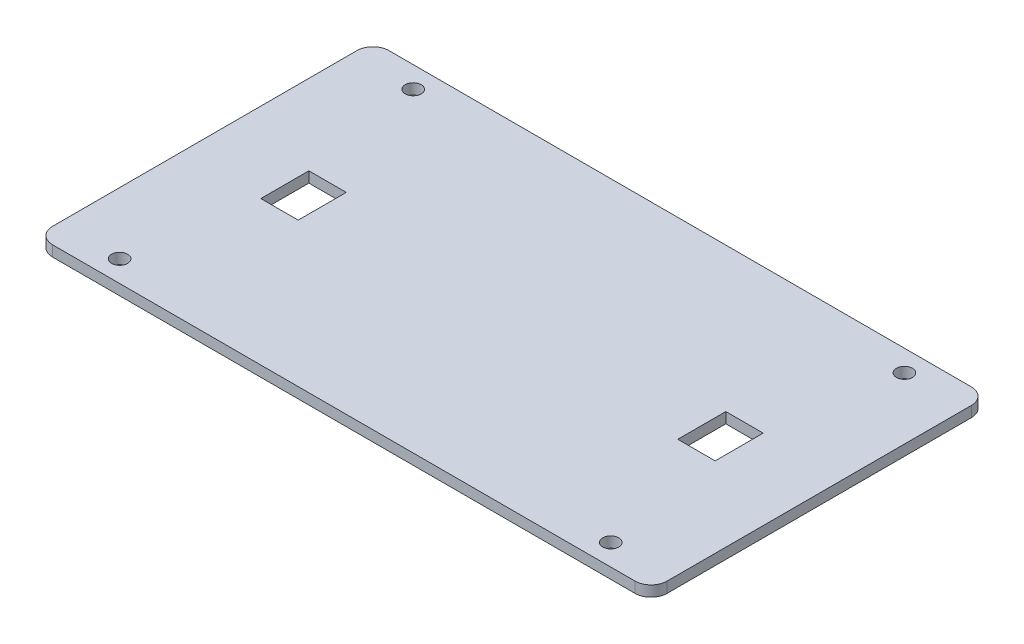
ISO-10303-21;
HEADER;
FILE_DESCRIPTION(('STEP AP214'),'2;1');
FILE_NAME('part.step','',(''),(''),'','','');
FILE_SCHEMA(('AUTOMOTIVE_DESIGN { 1 0 10303 214 1 1 1 1 }'));
ENDSEC;
DATA;
#1=APPLICATION_CONTEXT('core data for automotive mechanical design processes');
#2=APPLICATION_PROTOCOL_DEFINITION('international standard','automotive_design',2000,#1);
#3=PRODUCT_CONTEXT('',#1,'mechanical');
#4=PRODUCT('Part','Part','',(#3));
#5=PRODUCT_RELATED_PRODUCT_CATEGORY('part','',(#4));
#6=PRODUCT_DEFINITION_FORMATION('','',#4);
#7=PRODUCT_DEFINITION_CONTEXT('part definition',#1,'design');
#8=PRODUCT_DEFINITION('design','',#6,#7);
#9=PRODUCT_DEFINITION_SHAPE('','',#8);
#10=(LENGTH_UNIT() NAMED_UNIT(*) SI_UNIT(.MILLI.,.METRE.));
#11=(NAMED_UNIT(*) PLANE_ANGLE_UNIT() SI_UNIT($,.RADIAN.));
#12=(NAMED_UNIT(*) SI_UNIT($,.STERADIAN.) SOLID_ANGLE_UNIT());
#13=UNCERTAINTY_MEASURE_WITH_UNIT(LENGTH_MEASURE(1.E-05),#10,'distance_accuracy_value','');
#14=(GEOMETRIC_REPRESENTATION_CONTEXT(3) GLOBAL_UNCERTAINTY_ASSIGNED_CONTEXT((#13)) GLOBAL_UNIT_ASSIGNED_CONTEXT((#10,
#11,#12)) REPRESENTATION_CONTEXT('',''));
#15=CARTESIAN_POINT('',(0.,0.,0.));
#16=DIRECTION('',(0.,0.,1.));
#17=DIRECTION('',(1.,0.,0.));
#18=AXIS2_PLACEMENT_3D('',#15,#16,#17);
#19=CARTESIAN_POINT('',(-57.5483884452991,2.,31.5));
#20=DIRECTION('',(1.,0.,0.));
#21=DIRECTION('',(0.,0.,-1.));
#22=AXIS2_PLACEMENT_3D('',#19,#20,#21);
#23=PLANE('',#22);
#24=DIRECTION('',(0.,0.,1.));
#25=VECTOR('',#24,1.);
#26=CARTESIAN_POINT('',(-57.5483884452991,0.,31.5));
#27=LINE('',#26,#25);
#28=CARTESIAN_POINT('',(-57.5483884452991,0.,-28.5));
#29=VERTEX_POINT('',#28);
#30=CARTESIAN_POINT('',(-57.5483884452991,0.,28.5));
#31=VERTEX_POINT('',#30);
#32=EDGE_CURVE('E255',#29,#31,#27,.T.);
#33=ORIENTED_EDGE('',*,*,#32,.T.);
#34=DIRECTION('',(0.,-1.,0.));
#35=VECTOR('',#34,1.);
#36=CARTESIAN_POINT('',(-57.5483884452991,2.,28.5));
#37=LINE('',#36,#35);
#38=CARTESIAN_POINT('',(-57.5483884452991,2.,28.5));
#39=VERTEX_POINT('',#38);
#40=EDGE_CURVE('E11',#31,#39,#37,.F.);
#41=ORIENTED_EDGE('',*,*,#40,.T.);
#42=DIRECTION('',(0.,0.,1.));
#43=VECTOR('',#42,1.);
#44=CARTESIAN_POINT('',(-57.5483884452991,2.,31.5));
#45=LINE('',#44,#43);
#46=CARTESIAN_POINT('',(-57.5483884452991,2.,-28.5));
#47=VERTEX_POINT('',#46);
#48=EDGE_CURVE('E256',#47,#39,#45,.T.);
#49=ORIENTED_EDGE('',*,*,#48,.F.);
#50=DIRECTION('',(0.,-1.,0.));
#51=VECTOR('',#50,1.);
#52=CARTESIAN_POINT('',(-57.5483884452991,2.,-28.5));
#53=LINE('',#52,#51);
#54=EDGE_CURVE('E48',#47,#29,#53,.T.);
#55=ORIENTED_EDGE('',*,*,#54,.T.);
#56=EDGE_LOOP('',(#33,#41,#49,#55));
#57=FACE_BOUND('',#56,.T.);
#58=ADVANCED_FACE('F39',(#57),#23,.F.);
#59=CARTESIAN_POINT('',(57.548388445299,2.,31.5));
#60=DIRECTION('',(0.,0.,-1.));
#61=DIRECTION('',(-1.,0.,0.));
#62=AXIS2_PLACEMENT_3D('',#59,#60,#61);
#63=PLANE('',#62);
#64=DIRECTION('',(1.,0.,0.));
#65=VECTOR('',#64,1.);
#66=CARTESIAN_POINT('',(57.548388445299,0.,31.5));
#67=LINE('',#66,#65);
#68=CARTESIAN_POINT('',(-54.5483884452991,0.,31.5));
#69=VERTEX_POINT('',#68);
#70=CARTESIAN_POINT('',(54.548388445299,0.,31.5));
#71=VERTEX_POINT('',#70);
#72=EDGE_CURVE('E277',#69,#71,#67,.T.);
#73=ORIENTED_EDGE('',*,*,#72,.T.);
#74=DIRECTION('',(0.,-1.,0.));
#75=VECTOR('',#74,1.);
#76=CARTESIAN_POINT('',(54.548388445299,2.,31.5));
#77=LINE('',#76,#75);
#78=CARTESIAN_POINT('',(54.548388445299,2.,31.5));
#79=VERTEX_POINT('',#78);
#80=EDGE_CURVE('E329',#71,#79,#77,.F.);
#81=ORIENTED_EDGE('',*,*,#80,.T.);
#82=DIRECTION('',(1.,0.,0.));
#83=VECTOR('',#82,1.);
#84=CARTESIAN_POINT('',(57.548388445299,2.,31.5));
#85=LINE('',#84,#83);
#86=CARTESIAN_POINT('',(-54.5483884452991,2.,31.5));
#87=VERTEX_POINT('',#86);
#88=EDGE_CURVE('E260',#87,#79,#85,.T.);
#89=ORIENTED_EDGE('',*,*,#88,.F.);
#90=DIRECTION('',(0.,-1.,0.));
#91=VECTOR('',#90,1.);
#92=CARTESIAN_POINT('',(-54.5483884452991,2.,31.5));
#93=LINE('',#92,#91);
#94=EDGE_CURVE('E325',#87,#69,#93,.T.);
#95=ORIENTED_EDGE('',*,*,#94,.T.);
#96=EDGE_LOOP('',(#73,#81,#89,#95));
#97=FACE_BOUND('',#96,.T.);
#98=ADVANCED_FACE('F349',(#97),#63,.F.);
#99=CARTESIAN_POINT('',(57.548388445299,2.,-31.5));
#100=DIRECTION('',(-1.,0.,0.));
#101=DIRECTION('',(0.,0.,1.));
#102=AXIS2_PLACEMENT_3D('',#99,#100,#101);
#103=PLANE('',#102);
#104=DIRECTION('',(0.,0.,-1.));
#105=VECTOR('',#104,1.);
#106=CARTESIAN_POINT('',(57.548388445299,0.,-31.5));
#107=LINE('',#106,#105);
#108=CARTESIAN_POINT('',(57.548388445299,0.,28.5));
#109=VERTEX_POINT('',#108);
#110=CARTESIAN_POINT('',(57.548388445299,0.,-28.5));
#111=VERTEX_POINT('',#110);
#112=EDGE_CURVE('E281',#109,#111,#107,.T.);
#113=ORIENTED_EDGE('',*,*,#112,.T.);
#114=DIRECTION('',(0.,-1.,0.));
#115=VECTOR('',#114,1.);
#116=CARTESIAN_POINT('',(57.548388445299,2.,-28.5));
#117=LINE('',#116,#115);
#118=CARTESIAN_POINT('',(57.548388445299,2.,-28.5));
#119=VERTEX_POINT('',#118);
#120=EDGE_CURVE('E310',#111,#119,#117,.F.);
#121=ORIENTED_EDGE('',*,*,#120,.T.);
#122=DIRECTION('',(0.,0.,-1.));
#123=VECTOR('',#122,1.);
#124=CARTESIAN_POINT('',(57.548388445299,2.,-31.5));
#125=LINE('',#124,#123);
#126=CARTESIAN_POINT('',(57.548388445299,2.,28.5));
#127=VERTEX_POINT('',#126);
#128=EDGE_CURVE('E265',#127,#119,#125,.T.);
#129=ORIENTED_EDGE('',*,*,#128,.F.);
#130=DIRECTION('',(0.,-1.,0.));
#131=VECTOR('',#130,1.);
#132=CARTESIAN_POINT('',(57.548388445299,2.,28.5));
#133=LINE('',#132,#131);
#134=EDGE_CURVE('E306',#127,#109,#133,.T.);
#135=ORIENTED_EDGE('',*,*,#134,.T.);
#136=EDGE_LOOP('',(#113,#121,#129,#135));
#137=FACE_BOUND('',#136,.T.);
#138=ADVANCED_FACE('F360',(#137),#103,.F.);
#139=CARTESIAN_POINT('',(-57.5483884452991,2.,-31.5));
#140=DIRECTION('',(0.,0.,1.));
#141=DIRECTION('',(1.,0.,0.));
#142=AXIS2_PLACEMENT_3D('',#139,#140,#141);
#143=PLANE('',#142);
#144=DIRECTION('',(-1.,0.,0.));
#145=VECTOR('',#144,1.);
#146=CARTESIAN_POINT('',(-57.5483884452991,2.,-31.5));
#147=LINE('',#146,#145);
#148=CARTESIAN_POINT('',(54.548388445299,2.,-31.5));
#149=VERTEX_POINT('',#148);
#150=CARTESIAN_POINT('',(-54.5483884452991,2.,-31.5));
#151=VERTEX_POINT('',#150);
#152=EDGE_CURVE('E269',#149,#151,#147,.T.);
#153=ORIENTED_EDGE('',*,*,#152,.F.);
#154=DIRECTION('',(0.,-1.,0.));
#155=VECTOR('',#154,1.);
#156=CARTESIAN_POINT('',(54.548388445299,2.,-31.5));
#157=LINE('',#156,#155);
#158=CARTESIAN_POINT('',(54.548388445299,0.,-31.5));
#159=VERTEX_POINT('',#158);
#160=EDGE_CURVE('E290',#149,#159,#157,.T.);
#161=ORIENTED_EDGE('',*,*,#160,.T.);
#162=DIRECTION('',(-1.,0.,0.));
#163=VECTOR('',#162,1.);
#164=CARTESIAN_POINT('',(-57.5483884452991,0.,-31.5));
#165=LINE('',#164,#163);
#166=CARTESIAN_POINT('',(-54.5483884452991,0.,-31.5));
#167=VERTEX_POINT('',#166);
#168=EDGE_CURVE('E261',#159,#167,#165,.T.);
#169=ORIENTED_EDGE('',*,*,#168,.T.);
#170=DIRECTION('',(0.,-1.,0.));
#171=VECTOR('',#170,1.);
#172=CARTESIAN_POINT('',(-54.5483884452991,2.,-31.5));
#173=LINE('',#172,#171);
#174=EDGE_CURVE('E273',#167,#151,#173,.F.);
#175=ORIENTED_EDGE('',*,*,#174,.T.);
#176=EDGE_LOOP('',(#153,#161,#169,#175));
#177=FACE_BOUND('',#176,.T.);
#178=ADVANCED_FACE('F368',(#177),#143,.F.);
#179=CARTESIAN_POINT('',(0.,2.,0.));
#180=DIRECTION('',(0.,-1.,0.));
#181=DIRECTION('',(0.,0.,-1.));
#182=AXIS2_PLACEMENT_3D('',#179,#180,#181);
#183=PLANE('',#182);
#184=CARTESIAN_POINT('',(-45.998388445299,2.,27.5));
#185=DIRECTION('',(0.,1.,0.));
#186=DIRECTION('',(0.,0.,-1.));
#187=AXIS2_PLACEMENT_3D('',#184,#185,#186);
#188=CIRCLE('',#187,1.5);
#189=CARTESIAN_POINT('',(-45.998388445299,2.,26.));
#190=VERTEX_POINT('',#189);
#191=EDGE_CURVE('E571',#190,#190,#188,.T.);
#192=ORIENTED_EDGE('',*,*,#191,.F.);
#193=EDGE_LOOP('',(#192));
#194=FACE_BOUND('',#193,.T.);
#195=CARTESIAN_POINT('',(45.998388445299,2.,27.5));
#196=DIRECTION('',(0.,1.,0.));
#197=DIRECTION('',(0.,0.,1.));
#198=AXIS2_PLACEMENT_3D('',#195,#196,#197);
#199=CIRCLE('',#198,1.5);
#200=CARTESIAN_POINT('',(45.998388445299,2.,29.));
#201=VERTEX_POINT('',#200);
#202=EDGE_CURVE('E575',#201,#201,#199,.T.);
#203=ORIENTED_EDGE('',*,*,#202,.F.);
#204=EDGE_LOOP('',(#203));
#205=FACE_BOUND('',#204,.T.);
#206=CARTESIAN_POINT('',(45.998388445299,2.,-27.5));
#207=DIRECTION('',(0.,1.,0.));
#208=DIRECTION('',(0.,0.,-1.));
#209=AXIS2_PLACEMENT_3D('',#206,#207,#208);
#210=CIRCLE('',#209,1.5);
#211=CARTESIAN_POINT('',(45.998388445299,2.,-29.));
#212=VERTEX_POINT('',#211);
#213=EDGE_CURVE('E589',#212,#212,#210,.T.);
#214=ORIENTED_EDGE('',*,*,#213,.F.);
#215=EDGE_LOOP('',(#214));
#216=FACE_BOUND('',#215,.T.);
#217=CARTESIAN_POINT('',(-45.9983884452991,2.,-27.5));
#218=DIRECTION('',(0.,1.,0.));
#219=DIRECTION('',(0.,0.,1.));
#220=AXIS2_PLACEMENT_3D('',#217,#218,#219);
#221=CIRCLE('',#220,1.5);
#222=CARTESIAN_POINT('',(-45.9983884452991,2.,-26.));
#223=VERTEX_POINT('',#222);
#224=EDGE_CURVE('E184',#223,#223,#221,.T.);
#225=ORIENTED_EDGE('',*,*,#224,.F.);
#226=EDGE_LOOP('',(#225));
#227=FACE_BOUND('',#226,.T.);
#228=DIRECTION('',(0.,0.,-1.));
#229=VECTOR('',#228,1.);
#230=CARTESIAN_POINT('',(-42.5483884452991,2.,0.));
#231=LINE('',#230,#229);
#232=CARTESIAN_POINT('',(-42.5483884452991,2.,4.5));
#233=VERTEX_POINT('',#232);
#234=CARTESIAN_POINT('',(-42.5483884452991,2.,-4.5));
#235=VERTEX_POINT('',#234);
#236=EDGE_CURVE('E242',#233,#235,#231,.T.);
#237=ORIENTED_EDGE('',*,*,#236,.T.);
#238=DIRECTION('',(1.,0.,0.));
#239=VECTOR('',#238,1.);
#240=CARTESIAN_POINT('',(0.,2.,-4.5));
#241=LINE('',#240,#239);
#242=CARTESIAN_POINT('',(-35.5483884452991,2.,-4.5));
#243=VERTEX_POINT('',#242);
#244=EDGE_CURVE('E157',#235,#243,#241,.T.);
#245=ORIENTED_EDGE('',*,*,#244,.T.);
#246=DIRECTION('',(0.,0.,1.));
#247=VECTOR('',#246,1.);
#248=CARTESIAN_POINT('',(-35.5483884452991,2.,0.));
#249=LINE('',#248,#247);
#250=CARTESIAN_POINT('',(-35.5483884452991,2.,4.5));
#251=VERTEX_POINT('',#250);
#252=EDGE_CURVE('E249',#243,#251,#249,.T.);
#253=ORIENTED_EDGE('',*,*,#252,.T.);
#254=DIRECTION('',(-1.,0.,0.));
#255=VECTOR('',#254,1.);
#256=CARTESIAN_POINT('',(0.,2.,4.5));
#257=LINE('',#256,#255);
#258=EDGE_CURVE('E245',#251,#233,#257,.T.);
#259=ORIENTED_EDGE('',*,*,#258,.T.);
#260=EDGE_LOOP('',(#237,#245,#253,#259));
#261=FACE_BOUND('',#260,.T.);
#262=DIRECTION('',(-1.,0.,0.));
#263=VECTOR('',#262,1.);
#264=CARTESIAN_POINT('',(0.,2.,4.5));
#265=LINE('',#264,#263);
#266=CARTESIAN_POINT('',(42.5483884452991,2.,4.5));
#267=VERTEX_POINT('',#266);
#268=CARTESIAN_POINT('',(35.5483884452991,2.,4.5));
#269=VERTEX_POINT('',#268);
#270=EDGE_CURVE('E194',#267,#269,#265,.T.);
#271=ORIENTED_EDGE('',*,*,#270,.T.);
#272=DIRECTION('',(0.,0.,-1.));
#273=VECTOR('',#272,1.);
#274=CARTESIAN_POINT('',(35.5483884452991,2.,0.));
#275=LINE('',#274,#273);
#276=CARTESIAN_POINT('',(35.5483884452991,2.,-4.5));
#277=VERTEX_POINT('',#276);
#278=EDGE_CURVE('E238',#269,#277,#275,.T.);
#279=ORIENTED_EDGE('',*,*,#278,.T.);
#280=DIRECTION('',(1.,0.,0.));
#281=VECTOR('',#280,1.);
#282=CARTESIAN_POINT('',(0.,2.,-4.5));
#283=LINE('',#282,#281);
#284=CARTESIAN_POINT('',(42.5483884452991,2.,-4.5));
#285=VERTEX_POINT('',#284);
#286=EDGE_CURVE('E234',#277,#285,#283,.T.);
#287=ORIENTED_EDGE('',*,*,#286,.T.);
#288=DIRECTION('',(0.,0.,1.));
#289=VECTOR('',#288,1.);
#290=CARTESIAN_POINT('',(42.5483884452991,2.,0.));
#291=LINE('',#290,#289);
#292=EDGE_CURVE('E230',#285,#267,#291,.T.);
#293=ORIENTED_EDGE('',*,*,#292,.T.);
#294=EDGE_LOOP('',(#271,#279,#287,#293));
#295=FACE_BOUND('',#294,.T.);
#296=ORIENTED_EDGE('',*,*,#128,.T.);
#297=CARTESIAN_POINT('',(54.548388445299,2.,-28.5));
#298=DIRECTION('',(0.,-1.,0.));
#299=DIRECTION('',(0.,0.,-1.));
#300=AXIS2_PLACEMENT_3D('',#297,#298,#299);
#301=CIRCLE('',#300,3.);
#302=EDGE_CURVE('E322',#119,#149,#301,.F.);
#303=ORIENTED_EDGE('',*,*,#302,.T.);
#304=ORIENTED_EDGE('',*,*,#152,.T.);
#305=CARTESIAN_POINT('',(-54.5483884452991,2.,-28.5));
#306=DIRECTION('',(0.,-1.,0.));
#307=DIRECTION('',(0.,0.,-1.));
#308=AXIS2_PLACEMENT_3D('',#305,#306,#307);
#309=CIRCLE('',#308,3.);
#310=EDGE_CURVE('E313',#151,#47,#309,.F.);
#311=ORIENTED_EDGE('',*,*,#310,.T.);
#312=ORIENTED_EDGE('',*,*,#48,.T.);
#313=CARTESIAN_POINT('',(-54.5483884452991,2.,28.5));
#314=DIRECTION('',(0.,-1.,0.));
#315=DIRECTION('',(0.,0.,-1.));
#316=AXIS2_PLACEMENT_3D('',#313,#314,#315);
#317=CIRCLE('',#316,3.);
#318=EDGE_CURVE('E316',#39,#87,#317,.F.);
#319=ORIENTED_EDGE('',*,*,#318,.T.);
#320=ORIENTED_EDGE('',*,*,#88,.T.);
#321=CARTESIAN_POINT('',(54.548388445299,2.,28.5));
#322=DIRECTION('',(0.,-1.,0.));
#323=DIRECTION('',(0.,0.,-1.));
#324=AXIS2_PLACEMENT_3D('',#321,#322,#323);
#325=CIRCLE('',#324,3.);
#326=EDGE_CURVE('E319',#79,#127,#325,.F.);
#327=ORIENTED_EDGE('',*,*,#326,.T.);
#328=EDGE_LOOP('',(#296,#303,#304,#311,#312,#319,#320,#327));
#329=FACE_BOUND('',#328,.T.);
#330=ADVANCED_FACE('F353',(#194,#205,#216,#227,#261,#295,#329),#183,.F.);
#331=CARTESIAN_POINT('',(0.,0.,0.));
#332=DIRECTION('',(0.,-1.,0.));
#333=DIRECTION('',(0.,0.,-1.));
#334=AXIS2_PLACEMENT_3D('',#331,#332,#333);
#335=PLANE('',#334);
#336=CARTESIAN_POINT('',(-45.998388445299,0.,27.5));
#337=DIRECTION('',(0.,1.,0.));
#338=DIRECTION('',(0.,0.,-1.));
#339=AXIS2_PLACEMENT_3D('',#336,#337,#338);
#340=CIRCLE('',#339,1.5);
#341=CARTESIAN_POINT('',(-45.998388445299,0.,26.));
#342=VERTEX_POINT('',#341);
#343=EDGE_CURVE('E568',#342,#342,#340,.T.);
#344=ORIENTED_EDGE('',*,*,#343,.T.);
#345=EDGE_LOOP('',(#344));
#346=FACE_BOUND('',#345,.T.);
#347=CARTESIAN_POINT('',(45.998388445299,0.,27.5));
#348=DIRECTION('',(0.,1.,0.));
#349=DIRECTION('',(0.,0.,1.));
#350=AXIS2_PLACEMENT_3D('',#347,#348,#349);
#351=CIRCLE('',#350,1.5);
#352=CARTESIAN_POINT('',(45.998388445299,0.,29.));
#353=VERTEX_POINT('',#352);
#354=EDGE_CURVE('E595',#353,#353,#351,.T.);
#355=ORIENTED_EDGE('',*,*,#354,.T.);
#356=EDGE_LOOP('',(#355));
#357=FACE_BOUND('',#356,.T.);
#358=CARTESIAN_POINT('',(45.998388445299,0.,-27.5));
#359=DIRECTION('',(0.,1.,0.));
#360=DIRECTION('',(0.,0.,-1.));
#361=AXIS2_PLACEMENT_3D('',#358,#359,#360);
#362=CIRCLE('',#361,1.5);
#363=CARTESIAN_POINT('',(45.998388445299,0.,-29.));
#364=VERTEX_POINT('',#363);
#365=EDGE_CURVE('E584',#364,#364,#362,.T.);
#366=ORIENTED_EDGE('',*,*,#365,.T.);
#367=EDGE_LOOP('',(#366));
#368=FACE_BOUND('',#367,.T.);
#369=CARTESIAN_POINT('',(-45.9983884452991,0.,-27.5));
#370=DIRECTION('',(0.,1.,0.));
#371=DIRECTION('',(0.,0.,1.));
#372=AXIS2_PLACEMENT_3D('',#369,#370,#371);
#373=CIRCLE('',#372,1.5);
#374=CARTESIAN_POINT('',(-45.9983884452991,0.,-26.));
#375=VERTEX_POINT('',#374);
#376=EDGE_CURVE('E206',#375,#375,#373,.T.);
#377=ORIENTED_EDGE('',*,*,#376,.T.);
#378=EDGE_LOOP('',(#377));
#379=FACE_BOUND('',#378,.T.);
#380=DIRECTION('',(-1.,0.,0.));
#381=VECTOR('',#380,1.);
#382=CARTESIAN_POINT('',(-42.5483884452991,0.,-4.5));
#383=LINE('',#382,#381);
#384=CARTESIAN_POINT('',(-35.5483884452991,0.,-4.5));
#385=VERTEX_POINT('',#384);
#386=CARTESIAN_POINT('',(-42.5483884452991,0.,-4.5));
#387=VERTEX_POINT('',#386);
#388=EDGE_CURVE('E154',#385,#387,#383,.T.);
#389=ORIENTED_EDGE('',*,*,#388,.T.);
#390=DIRECTION('',(0.,0.,1.));
#391=VECTOR('',#390,1.);
#392=CARTESIAN_POINT('',(-42.5483884452991,0.,4.5));
#393=LINE('',#392,#391);
#394=CARTESIAN_POINT('',(-42.5483884452991,0.,4.5));
#395=VERTEX_POINT('',#394);
#396=EDGE_CURVE('E165',#387,#395,#393,.T.);
#397=ORIENTED_EDGE('',*,*,#396,.T.);
#398=DIRECTION('',(1.,0.,0.));
#399=VECTOR('',#398,1.);
#400=CARTESIAN_POINT('',(-35.5483884452991,0.,4.5));
#401=LINE('',#400,#399);
#402=CARTESIAN_POINT('',(-35.5483884452991,0.,4.5));
#403=VERTEX_POINT('',#402);
#404=EDGE_CURVE('E171',#395,#403,#401,.T.);
#405=ORIENTED_EDGE('',*,*,#404,.T.);
#406=DIRECTION('',(0.,0.,-1.));
#407=VECTOR('',#406,1.);
#408=CARTESIAN_POINT('',(-35.5483884452991,0.,-4.5));
#409=LINE('',#408,#407);
#410=EDGE_CURVE('E161',#403,#385,#409,.T.);
#411=ORIENTED_EDGE('',*,*,#410,.T.);
#412=EDGE_LOOP('',(#389,#397,#405,#411));
#413=FACE_BOUND('',#412,.T.);
#414=DIRECTION('',(0.,0.,1.));
#415=VECTOR('',#414,1.);
#416=CARTESIAN_POINT('',(35.5483884452991,0.,-4.5));
#417=LINE('',#416,#415);
#418=CARTESIAN_POINT('',(35.5483884452991,0.,-4.5));
#419=VERTEX_POINT('',#418);
#420=CARTESIAN_POINT('',(35.5483884452991,0.,4.5));
#421=VERTEX_POINT('',#420);
#422=EDGE_CURVE('E201',#419,#421,#417,.T.);
#423=ORIENTED_EDGE('',*,*,#422,.T.);
#424=DIRECTION('',(1.,0.,0.));
#425=VECTOR('',#424,1.);
#426=CARTESIAN_POINT('',(35.5483884452991,0.,4.5));
#427=LINE('',#426,#425);
#428=CARTESIAN_POINT('',(42.5483884452991,0.,4.5));
#429=VERTEX_POINT('',#428);
#430=EDGE_CURVE('E205',#421,#429,#427,.T.);
#431=ORIENTED_EDGE('',*,*,#430,.T.);
#432=DIRECTION('',(0.,0.,-1.));
#433=VECTOR('',#432,1.);
#434=CARTESIAN_POINT('',(42.5483884452991,0.,4.5));
#435=LINE('',#434,#433);
#436=CARTESIAN_POINT('',(42.5483884452991,0.,-4.5));
#437=VERTEX_POINT('',#436);
#438=EDGE_CURVE('E210',#429,#437,#435,.T.);
#439=ORIENTED_EDGE('',*,*,#438,.T.);
#440=DIRECTION('',(-1.,0.,0.));
#441=VECTOR('',#440,1.);
#442=CARTESIAN_POINT('',(42.5483884452991,0.,-4.5));
#443=LINE('',#442,#441);
#444=EDGE_CURVE('E214',#437,#419,#443,.T.);
#445=ORIENTED_EDGE('',*,*,#444,.T.);
#446=EDGE_LOOP('',(#423,#431,#439,#445));
#447=FACE_BOUND('',#446,.T.);
#448=ORIENTED_EDGE('',*,*,#168,.F.);
#449=CARTESIAN_POINT('',(54.548388445299,0.,-28.5));
#450=DIRECTION('',(0.,-1.,0.));
#451=DIRECTION('',(0.,0.,-1.));
#452=AXIS2_PLACEMENT_3D('',#449,#450,#451);
#453=CIRCLE('',#452,3.);
#454=EDGE_CURVE('E303',#159,#111,#453,.T.);
#455=ORIENTED_EDGE('',*,*,#454,.T.);
#456=ORIENTED_EDGE('',*,*,#112,.F.);
#457=CARTESIAN_POINT('',(54.548388445299,0.,28.5));
#458=DIRECTION('',(0.,-1.,0.));
#459=DIRECTION('',(0.,0.,-1.));
#460=AXIS2_PLACEMENT_3D('',#457,#458,#459);
#461=CIRCLE('',#460,3.);
#462=EDGE_CURVE('E300',#109,#71,#461,.T.);
#463=ORIENTED_EDGE('',*,*,#462,.T.);
#464=ORIENTED_EDGE('',*,*,#72,.F.);
#465=CARTESIAN_POINT('',(-54.5483884452991,0.,28.5));
#466=DIRECTION('',(0.,-1.,0.));
#467=DIRECTION('',(0.,0.,-1.));
#468=AXIS2_PLACEMENT_3D('',#465,#466,#467);
#469=CIRCLE('',#468,3.);
#470=EDGE_CURVE('E297',#69,#31,#469,.T.);
#471=ORIENTED_EDGE('',*,*,#470,.T.);
#472=ORIENTED_EDGE('',*,*,#32,.F.);
#473=CARTESIAN_POINT('',(-54.5483884452991,0.,-28.5));
#474=DIRECTION('',(0.,-1.,0.));
#475=DIRECTION('',(0.,0.,-1.));
#476=AXIS2_PLACEMENT_3D('',#473,#474,#475);
#477=CIRCLE('',#476,3.);
#478=EDGE_CURVE('E294',#29,#167,#477,.T.);
#479=ORIENTED_EDGE('',*,*,#478,.T.);
#480=EDGE_LOOP('',(#448,#455,#456,#463,#464,#471,#472,#479));
#481=FACE_BOUND('',#480,.T.);
#482=ADVANCED_FACE('F173',(#346,#357,#368,#379,#413,#447,#481),#335,.T.);
#483=CARTESIAN_POINT('',(54.548388445299,2.,-28.5));
#484=DIRECTION('',(0.,-1.,0.));
#485=DIRECTION('',(0.,0.,-1.));
#486=AXIS2_PLACEMENT_3D('',#483,#484,#485);
#487=CYLINDRICAL_SURFACE('',#486,3.);
#488=ORIENTED_EDGE('',*,*,#302,.F.);
#489=ORIENTED_EDGE('',*,*,#120,.F.);
#490=ORIENTED_EDGE('',*,*,#454,.F.);
#491=ORIENTED_EDGE('',*,*,#160,.F.);
#492=EDGE_LOOP('',(#488,#489,#490,#491));
#493=FACE_BOUND('',#492,.T.);
#494=ADVANCED_FACE('F365',(#493),#487,.T.);
#495=CARTESIAN_POINT('',(54.548388445299,2.,28.5));
#496=DIRECTION('',(0.,-1.,0.));
#497=DIRECTION('',(0.,0.,-1.));
#498=AXIS2_PLACEMENT_3D('',#495,#496,#497);
#499=CYLINDRICAL_SURFACE('',#498,3.);
#500=ORIENTED_EDGE('',*,*,#326,.F.);
#501=ORIENTED_EDGE('',*,*,#80,.F.);
#502=ORIENTED_EDGE('',*,*,#462,.F.);
#503=ORIENTED_EDGE('',*,*,#134,.F.);
#504=EDGE_LOOP('',(#500,#501,#502,#503));
#505=FACE_BOUND('',#504,.T.);
#506=ADVANCED_FACE('F357',(#505),#499,.T.);
#507=CARTESIAN_POINT('',(-54.5483884452991,2.,28.5));
#508=DIRECTION('',(0.,-1.,0.));
#509=DIRECTION('',(0.,0.,-1.));
#510=AXIS2_PLACEMENT_3D('',#507,#508,#509);
#511=CYLINDRICAL_SURFACE('',#510,3.);
#512=ORIENTED_EDGE('',*,*,#318,.F.);
#513=ORIENTED_EDGE('',*,*,#40,.F.);
#514=ORIENTED_EDGE('',*,*,#470,.F.);
#515=ORIENTED_EDGE('',*,*,#94,.F.);
#516=EDGE_LOOP('',(#512,#513,#514,#515));
#517=FACE_BOUND('',#516,.T.);
#518=ADVANCED_FACE('F346',(#517),#511,.T.);
#519=CARTESIAN_POINT('',(-54.5483884452991,2.,-28.5));
#520=DIRECTION('',(0.,-1.,0.));
#521=DIRECTION('',(0.,0.,-1.));
#522=AXIS2_PLACEMENT_3D('',#519,#520,#521);
#523=CYLINDRICAL_SURFACE('',#522,3.);
#524=ORIENTED_EDGE('',*,*,#310,.F.);
#525=ORIENTED_EDGE('',*,*,#174,.F.);
#526=ORIENTED_EDGE('',*,*,#478,.F.);
#527=ORIENTED_EDGE('',*,*,#54,.F.);
#528=EDGE_LOOP('',(#524,#525,#526,#527));
#529=FACE_BOUND('',#528,.T.);
#530=ADVANCED_FACE('F41',(#529),#523,.T.);
#531=CARTESIAN_POINT('',(35.5483884452991,0.,-4.5));
#532=DIRECTION('',(-1.,0.,0.));
#533=DIRECTION('',(0.,0.,1.));
#534=AXIS2_PLACEMENT_3D('',#531,#532,#533);
#535=PLANE('',#534);
#536=DIRECTION('',(0.,1.,0.));
#537=VECTOR('',#536,1.);
#538=CARTESIAN_POINT('',(35.5483884452991,0.,4.5));
#539=LINE('',#538,#537);
#540=EDGE_CURVE('E63',#421,#269,#539,.T.);
#541=ORIENTED_EDGE('',*,*,#540,.F.);
#542=ORIENTED_EDGE('',*,*,#422,.F.);
#543=DIRECTION('',(0.,1.,0.));
#544=VECTOR('',#543,1.);
#545=CARTESIAN_POINT('',(35.5483884452991,0.,-4.5));
#546=LINE('',#545,#544);
#547=EDGE_CURVE('E177',#419,#277,#546,.T.);
#548=ORIENTED_EDGE('',*,*,#547,.T.);
#549=ORIENTED_EDGE('',*,*,#278,.F.);
#550=EDGE_LOOP('',(#541,#542,#548,#549));
#551=FACE_BOUND('',#550,.T.);
#552=ADVANCED_FACE('F371',(#551),#535,.F.);
#553=CARTESIAN_POINT('',(42.5483884452991,0.,-4.5));
#554=DIRECTION('',(0.,0.,-1.));
#555=DIRECTION('',(-1.,0.,0.));
#556=AXIS2_PLACEMENT_3D('',#553,#554,#555);
#557=PLANE('',#556);
#558=ORIENTED_EDGE('',*,*,#547,.F.);
#559=ORIENTED_EDGE('',*,*,#444,.F.);
#560=DIRECTION('',(0.,1.,0.));
#561=VECTOR('',#560,1.);
#562=CARTESIAN_POINT('',(42.5483884452991,0.,-4.5));
#563=LINE('',#562,#561);
#564=EDGE_CURVE('E181',#437,#285,#563,.T.);
#565=ORIENTED_EDGE('',*,*,#564,.T.);
#566=ORIENTED_EDGE('',*,*,#286,.F.);
#567=EDGE_LOOP('',(#558,#559,#565,#566));
#568=FACE_BOUND('',#567,.T.);
#569=ADVANCED_FACE('F376',(#568),#557,.F.);
#570=CARTESIAN_POINT('',(42.5483884452991,0.,4.5));
#571=DIRECTION('',(1.,0.,0.));
#572=DIRECTION('',(0.,0.,-1.));
#573=AXIS2_PLACEMENT_3D('',#570,#571,#572);
#574=PLANE('',#573);
#575=ORIENTED_EDGE('',*,*,#564,.F.);
#576=ORIENTED_EDGE('',*,*,#438,.F.);
#577=DIRECTION('',(0.,1.,0.));
#578=VECTOR('',#577,1.);
#579=CARTESIAN_POINT('',(42.5483884452991,0.,4.5));
#580=LINE('',#579,#578);
#581=EDGE_CURVE('E221',#429,#267,#580,.T.);
#582=ORIENTED_EDGE('',*,*,#581,.T.);
#583=ORIENTED_EDGE('',*,*,#292,.F.);
#584=EDGE_LOOP('',(#575,#576,#582,#583));
#585=FACE_BOUND('',#584,.T.);
#586=ADVANCED_FACE('F418',(#585),#574,.F.);
#587=CARTESIAN_POINT('',(35.5483884452991,0.,4.5));
#588=DIRECTION('',(0.,0.,1.));
#589=DIRECTION('',(1.,0.,0.));
#590=AXIS2_PLACEMENT_3D('',#587,#588,#589);
#591=PLANE('',#590);
#592=ORIENTED_EDGE('',*,*,#581,.F.);
#593=ORIENTED_EDGE('',*,*,#430,.F.);
#594=ORIENTED_EDGE('',*,*,#540,.T.);
#595=ORIENTED_EDGE('',*,*,#270,.F.);
#596=EDGE_LOOP('',(#592,#593,#594,#595));
#597=FACE_BOUND('',#596,.T.);
#598=ADVANCED_FACE('F428',(#597),#591,.F.);
#599=CARTESIAN_POINT('',(-42.5483884452991,0.,-4.5));
#600=DIRECTION('',(0.,0.,-1.));
#601=DIRECTION('',(-1.,0.,0.));
#602=AXIS2_PLACEMENT_3D('',#599,#600,#601);
#603=PLANE('',#602);
#604=DIRECTION('',(0.,1.,0.));
#605=VECTOR('',#604,1.);
#606=CARTESIAN_POINT('',(-42.5483884452991,0.,-4.5));
#607=LINE('',#606,#605);
#608=EDGE_CURVE('E55',#387,#235,#607,.T.);
#609=ORIENTED_EDGE('',*,*,#608,.F.);
#610=ORIENTED_EDGE('',*,*,#388,.F.);
#611=DIRECTION('',(0.,1.,0.));
#612=VECTOR('',#611,1.);
#613=CARTESIAN_POINT('',(-35.5483884452991,0.,-4.5));
#614=LINE('',#613,#612);
#615=EDGE_CURVE('E191',#385,#243,#614,.T.);
#616=ORIENTED_EDGE('',*,*,#615,.T.);
#617=ORIENTED_EDGE('',*,*,#244,.F.);
#618=EDGE_LOOP('',(#609,#610,#616,#617));
#619=FACE_BOUND('',#618,.T.);
#620=ADVANCED_FACE('F151',(#619),#603,.F.);
#621=CARTESIAN_POINT('',(-35.5483884452991,0.,-4.5));
#622=DIRECTION('',(1.,0.,0.));
#623=DIRECTION('',(0.,0.,-1.));
#624=AXIS2_PLACEMENT_3D('',#621,#622,#623);
#625=PLANE('',#624);
#626=ORIENTED_EDGE('',*,*,#615,.F.);
#627=ORIENTED_EDGE('',*,*,#410,.F.);
#628=DIRECTION('',(0.,1.,0.));
#629=VECTOR('',#628,1.);
#630=CARTESIAN_POINT('',(-35.5483884452991,0.,4.5));
#631=LINE('',#630,#629);
#632=EDGE_CURVE('E195',#403,#251,#631,.T.);
#633=ORIENTED_EDGE('',*,*,#632,.T.);
#634=ORIENTED_EDGE('',*,*,#252,.F.);
#635=EDGE_LOOP('',(#626,#627,#633,#634));
#636=FACE_BOUND('',#635,.T.);
#637=ADVANCED_FACE('F446',(#636),#625,.F.);
#638=CARTESIAN_POINT('',(-35.5483884452991,0.,4.5));
#639=DIRECTION('',(0.,0.,1.));
#640=DIRECTION('',(1.,0.,0.));
#641=AXIS2_PLACEMENT_3D('',#638,#639,#640);
#642=PLANE('',#641);
#643=ORIENTED_EDGE('',*,*,#632,.F.);
#644=ORIENTED_EDGE('',*,*,#404,.F.);
#645=DIRECTION('',(0.,1.,0.));
#646=VECTOR('',#645,1.);
#647=CARTESIAN_POINT('',(-42.5483884452991,0.,4.5));
#648=LINE('',#647,#646);
#649=EDGE_CURVE('E160',#395,#233,#648,.T.);
#650=ORIENTED_EDGE('',*,*,#649,.T.);
#651=ORIENTED_EDGE('',*,*,#258,.F.);
#652=EDGE_LOOP('',(#643,#644,#650,#651));
#653=FACE_BOUND('',#652,.T.);
#654=ADVANCED_FACE('F455',(#653),#642,.F.);
#655=CARTESIAN_POINT('',(-42.5483884452991,0.,4.5));
#656=DIRECTION('',(-1.,0.,0.));
#657=DIRECTION('',(0.,0.,1.));
#658=AXIS2_PLACEMENT_3D('',#655,#656,#657);
#659=PLANE('',#658);
#660=ORIENTED_EDGE('',*,*,#649,.F.);
#661=ORIENTED_EDGE('',*,*,#396,.F.);
#662=ORIENTED_EDGE('',*,*,#608,.T.);
#663=ORIENTED_EDGE('',*,*,#236,.F.);
#664=EDGE_LOOP('',(#660,#661,#662,#663));
#665=FACE_BOUND('',#664,.T.);
#666=ADVANCED_FACE('F166',(#665),#659,.F.);
#667=CARTESIAN_POINT('',(-45.9983884452991,0.,-27.5));
#668=DIRECTION('',(0.,1.,0.));
#669=DIRECTION('',(0.,0.,1.));
#670=AXIS2_PLACEMENT_3D('',#667,#668,#669);
#671=CYLINDRICAL_SURFACE('',#670,1.5);
#672=ORIENTED_EDGE('',*,*,#376,.F.);
#673=EDGE_LOOP('',(#672));
#674=FACE_BOUND('',#673,.T.);
#675=ORIENTED_EDGE('',*,*,#224,.T.);
#676=EDGE_LOOP('',(#675));
#677=FACE_BOUND('',#676,.T.);
#678=ADVANCED_FACE('F474',(#674,#677),#671,.F.);
#679=CARTESIAN_POINT('',(45.998388445299,0.,-27.5));
#680=DIRECTION('',(0.,1.,0.));
#681=DIRECTION('',(0.,0.,1.));
#682=AXIS2_PLACEMENT_3D('',#679,#680,#681);
#683=CYLINDRICAL_SURFACE('',#682,1.5);
#684=ORIENTED_EDGE('',*,*,#365,.F.);
#685=EDGE_LOOP('',(#684));
#686=FACE_BOUND('',#685,.T.);
#687=ORIENTED_EDGE('',*,*,#213,.T.);
#688=EDGE_LOOP('',(#687));
#689=FACE_BOUND('',#688,.T.);
#690=ADVANCED_FACE('F503',(#686,#689),#683,.F.);
#691=CARTESIAN_POINT('',(45.998388445299,0.,27.5));
#692=DIRECTION('',(0.,1.,0.));
#693=DIRECTION('',(0.,0.,1.));
#694=AXIS2_PLACEMENT_3D('',#691,#692,#693);
#695=CYLINDRICAL_SURFACE('',#694,1.5);
#696=ORIENTED_EDGE('',*,*,#354,.F.);
#697=EDGE_LOOP('',(#696));
#698=FACE_BOUND('',#697,.T.);
#699=ORIENTED_EDGE('',*,*,#202,.T.);
#700=EDGE_LOOP('',(#699));
#701=FACE_BOUND('',#700,.T.);
#702=ADVANCED_FACE('F513',(#698,#701),#695,.F.);
#703=CARTESIAN_POINT('',(-45.998388445299,0.,27.5));
#704=DIRECTION('',(0.,1.,0.));
#705=DIRECTION('',(0.,0.,1.));
#706=AXIS2_PLACEMENT_3D('',#703,#704,#705);
#707=CYLINDRICAL_SURFACE('',#706,1.5);
#708=ORIENTED_EDGE('',*,*,#343,.F.);
#709=EDGE_LOOP('',(#708));
#710=FACE_BOUND('',#709,.T.);
#711=ORIENTED_EDGE('',*,*,#191,.T.);
#712=EDGE_LOOP('',(#711));
#713=FACE_BOUND('',#712,.T.);
#714=ADVANCED_FACE('F523',(#710,#713),#707,.F.);
#715=CLOSED_SHELL('',(#58,#98,#138,#178,#330,#482,#494,#506,#518,#530,#552,#569,#586,#598,#620,
#637,#654,#666,#678,#690,#702,#714));
#716=MANIFOLD_SOLID_BREP('B2',#715);
#717=ADVANCED_BREP_SHAPE_REPRESENTATION('',(#18,#716),#14);
#718=SHAPE_DEFINITION_REPRESENTATION(#9,#717);
ENDSEC;
END-ISO-10303-21;
